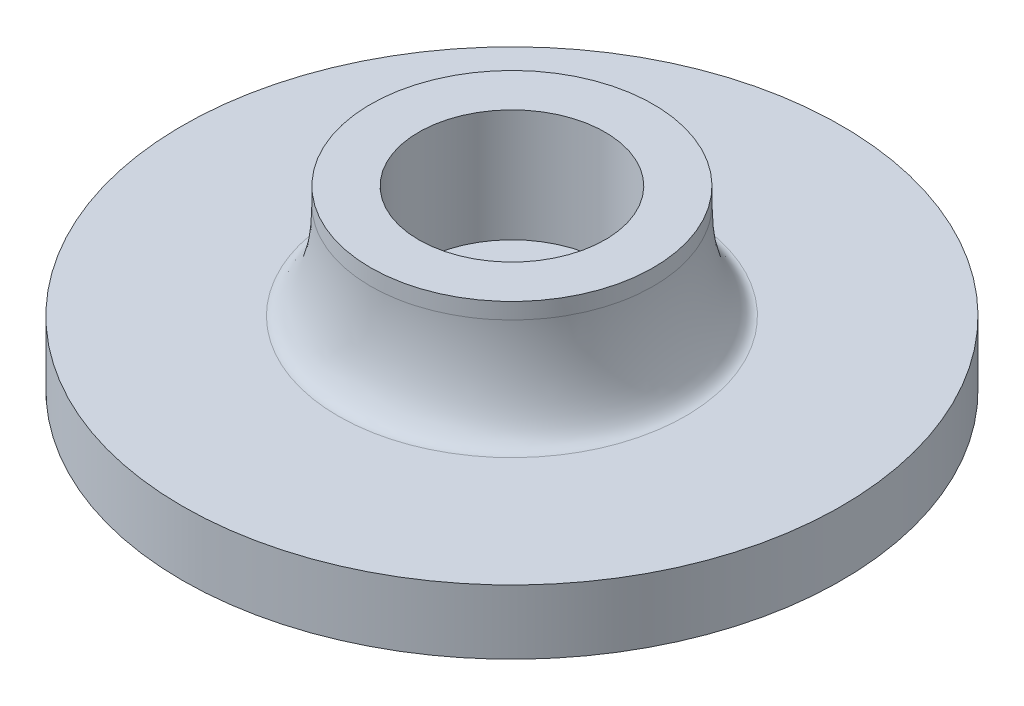
ISO-10303-21;
HEADER;
FILE_DESCRIPTION(('STEP AP214'),'2;1');
FILE_NAME('part.step','',(''),(''),'','','');
FILE_SCHEMA(('AUTOMOTIVE_DESIGN { 1 0 10303 214 1 1 1 1 }'));
ENDSEC;
DATA;
#1=APPLICATION_CONTEXT('core data for automotive mechanical design processes');
#2=APPLICATION_PROTOCOL_DEFINITION('international standard','automotive_design',2000,#1);
#3=PRODUCT_CONTEXT('',#1,'mechanical');
#4=PRODUCT('Part','Part','',(#3));
#5=PRODUCT_RELATED_PRODUCT_CATEGORY('part','',(#4));
#6=PRODUCT_DEFINITION_FORMATION('','',#4);
#7=PRODUCT_DEFINITION_CONTEXT('part definition',#1,'design');
#8=PRODUCT_DEFINITION('design','',#6,#7);
#9=PRODUCT_DEFINITION_SHAPE('','',#8);
#10=(LENGTH_UNIT() NAMED_UNIT(*) SI_UNIT(.MILLI.,.METRE.));
#11=(NAMED_UNIT(*) PLANE_ANGLE_UNIT() SI_UNIT($,.RADIAN.));
#12=(NAMED_UNIT(*) SI_UNIT($,.STERADIAN.) SOLID_ANGLE_UNIT());
#13=UNCERTAINTY_MEASURE_WITH_UNIT(LENGTH_MEASURE(1.E-05),#10,'distance_accuracy_value','');
#14=(GEOMETRIC_REPRESENTATION_CONTEXT(3) GLOBAL_UNCERTAINTY_ASSIGNED_CONTEXT((#13)) GLOBAL_UNIT_ASSIGNED_CONTEXT((#10,
#11,#12)) REPRESENTATION_CONTEXT('',''));
#15=CARTESIAN_POINT('',(0.,0.,0.));
#16=DIRECTION('',(0.,0.,1.));
#17=DIRECTION('',(1.,0.,0.));
#18=AXIS2_PLACEMENT_3D('',#15,#16,#17);
#19=CARTESIAN_POINT('',(0.,2.,0.));
#20=DIRECTION('',(0.,-1.,0.));
#21=DIRECTION('',(0.,0.,-1.));
#22=AXIS2_PLACEMENT_3D('',#19,#20,#21);
#23=CYLINDRICAL_SURFACE('',#22,10.25);
#24=CARTESIAN_POINT('',(0.,2.,0.));
#25=DIRECTION('',(0.,1.,0.));
#26=DIRECTION('',(0.,0.,1.));
#27=AXIS2_PLACEMENT_3D('',#24,#25,#26);
#28=CIRCLE('',#27,10.25);
#29=CARTESIAN_POINT('',(0.,2.,10.25));
#30=VERTEX_POINT('',#29);
#31=EDGE_CURVE('E59',#30,#30,#28,.T.);
#32=ORIENTED_EDGE('',*,*,#31,.F.);
#33=EDGE_LOOP('',(#32));
#34=FACE_BOUND('',#33,.T.);
#35=CARTESIAN_POINT('',(0.,0.,0.));
#36=DIRECTION('',(0.,1.,0.));
#37=DIRECTION('',(0.,0.,1.));
#38=AXIS2_PLACEMENT_3D('',#35,#36,#37);
#39=CIRCLE('',#38,10.25);
#40=CARTESIAN_POINT('',(0.,0.,10.25));
#41=VERTEX_POINT('',#40);
#42=EDGE_CURVE('E64',#41,#41,#39,.T.);
#43=ORIENTED_EDGE('',*,*,#42,.T.);
#44=EDGE_LOOP('',(#43));
#45=FACE_BOUND('',#44,.T.);
#46=ADVANCED_FACE('F36',(#34,#45),#23,.T.);
#47=CARTESIAN_POINT('',(0.,2.,0.));
#48=DIRECTION('',(0.,1.,0.));
#49=DIRECTION('',(0.,0.,1.));
#50=AXIS2_PLACEMENT_3D('',#47,#48,#49);
#51=PLANE('',#50);
#52=CARTESIAN_POINT('',(0.,2.,5.4));
#53=CARTESIAN_POINT('',(0.706858343018677,2.,5.4));
#54=CARTESIAN_POINT('',(1.41343857927273,2.,5.25945245246269));
#55=CARTESIAN_POINT('',(2.71954249027024,2.,4.71844649865921));
#56=CARTESIAN_POINT('',(3.3185522907213,2.,4.31820094609326));
#57=CARTESIAN_POINT('',(4.31820094609342,2.,3.31855229072145));
#58=CARTESIAN_POINT('',(4.71844649865906,2.,2.71954249027046));
#59=CARTESIAN_POINT('',(5.25945245246284,2.,1.41343857927251));
#60=CARTESIAN_POINT('',(5.4,2.,0.70685834301759));
#61=CARTESIAN_POINT('',(5.4,2.,-0.706858343017589));
#62=CARTESIAN_POINT('',(5.25945245246283,2.,-1.41343857927266));
#63=CARTESIAN_POINT('',(4.71844649865906,2.,-2.71954249027031));
#64=CARTESIAN_POINT('',(4.31820094609356,2.,-3.31855229072115));
#65=CARTESIAN_POINT('',(3.31855229072115,2.,-4.31820094609357));
#66=CARTESIAN_POINT('',(2.71954249027033,2.,-4.71844649865904));
#67=CARTESIAN_POINT('',(1.41343857927265,2.,-5.25945245246285));
#68=CARTESIAN_POINT('',(0.70685834301759,2.,-5.4));
#69=CARTESIAN_POINT('',(-0.706858343017589,2.,-5.4));
#70=CARTESIAN_POINT('',(-1.41343857927279,2.,-5.25945245246286));
#71=CARTESIAN_POINT('',(-2.71954249027016,2.,-4.71844649865905));
#72=CARTESIAN_POINT('',(-3.31855229072146,2.,-4.31820094609341));
#73=CARTESIAN_POINT('',(-4.31820094609326,2.,-3.3185522907213));
#74=CARTESIAN_POINT('',(-4.71844649865908,2.,-2.7195424902703));
#75=CARTESIAN_POINT('',(-5.25945245246281,2.,-1.41343857927268));
#76=CARTESIAN_POINT('',(-5.4,2.,-0.706858343017582));
#77=CARTESIAN_POINT('',(-5.4,2.,0.706858343017599));
#78=CARTESIAN_POINT('',(-5.25945245246282,2.,1.41343857927267));
#79=CARTESIAN_POINT('',(-4.71844649865908,2.,2.71954249027028));
#80=CARTESIAN_POINT('',(-4.31820094609345,2.,3.31855229072126));
#81=CARTESIAN_POINT('',(-3.31855229072129,2.,4.31820094609342));
#82=CARTESIAN_POINT('',(-2.7195424902703,2.,4.71844649865908));
#83=CARTESIAN_POINT('',(-1.41343857927269,2.,5.25945245246281));
#84=CARTESIAN_POINT('',(-0.706858343018678,2.,5.4));
#85=CARTESIAN_POINT('',(0.,2.,5.4));
#86=(BOUNDED_CURVE() B_SPLINE_CURVE(3,(#52,#53,#54,#55,#56,#57,#58,#59,#60,#61,#62,#63,#64,#65,
#66,#67,#68,#69,#70,#71,#72,#73,#74,#75,#76,#77,#78,#79,#80,#81,#82,#83,#84,#85),.UNSPECIFIED.,
.T.,.F.) B_SPLINE_CURVE_WITH_KNOTS((4,2,2,2,2,2,2,2,2,2,2,2,2,2,2,2,4),(0.,0.392699081698724,
0.785398163397448,1.17809724509617,1.5707963267949,1.96349540849362,2.35619449019234,
2.74889357189107,3.14159265358979,3.53429173528852,3.92699081698724,4.31968989868597,
4.71238898038469,5.10508806208341,5.49778714378214,5.89048622548086,6.28318530717959),
.UNSPECIFIED.) CURVE() GEOMETRIC_REPRESENTATION_ITEM() RATIONAL_B_SPLINE_CURVE((1.,1.,1.,1.,1.,
1.,1.,1.,1.,1.,1.,1.,1.,1.,1.,1.,1.,1.,1.,1.,1.,1.,1.,1.,1.,1.,1.,1.,1.,1.,1.,1.,1.,1.)) REPRESENTATION_ITEM(''));
#87=CARTESIAN_POINT('',(0.,2.,5.4));
#88=VERTEX_POINT('',#87);
#89=EDGE_CURVE('E11',#88,#88,#86,.F.);
#90=ORIENTED_EDGE('',*,*,#89,.T.);
#91=EDGE_LOOP('',(#90));
#92=FACE_BOUND('',#91,.T.);
#93=ORIENTED_EDGE('',*,*,#31,.T.);
#94=EDGE_LOOP('',(#93));
#95=FACE_BOUND('',#94,.T.);
#96=ADVANCED_FACE('F85',(#92,#95),#51,.T.);
#97=CARTESIAN_POINT('',(0.,0.,0.));
#98=DIRECTION('',(0.,1.,0.));
#99=DIRECTION('',(0.,0.,1.));
#100=AXIS2_PLACEMENT_3D('',#97,#98,#99);
#101=PLANE('',#100);
#102=CARTESIAN_POINT('',(0.,0.,0.));
#103=DIRECTION('',(0.,-1.,0.));
#104=DIRECTION('',(0.,0.,-1.));
#105=AXIS2_PLACEMENT_3D('',#102,#103,#104);
#106=CIRCLE('',#105,1.5);
#107=CARTESIAN_POINT('',(0.,0.,-1.5));
#108=VERTEX_POINT('',#107);
#109=EDGE_CURVE('E139',#108,#108,#106,.T.);
#110=ORIENTED_EDGE('',*,*,#109,.F.);
#111=EDGE_LOOP('',(#110));
#112=FACE_BOUND('',#111,.T.);
#113=ORIENTED_EDGE('',*,*,#42,.F.);
#114=EDGE_LOOP('',(#113));
#115=FACE_BOUND('',#114,.T.);
#116=ADVANCED_FACE('F89',(#112,#115),#101,.F.);
#117=CARTESIAN_POINT('',(0.,5.5,0.));
#118=DIRECTION('',(0.,1.,0.));
#119=DIRECTION('',(0.,0.,1.));
#120=AXIS2_PLACEMENT_3D('',#117,#118,#119);
#121=PLANE('',#120);
#122=CARTESIAN_POINT('',(0.,5.5,0.));
#123=DIRECTION('',(0.,1.,0.));
#124=DIRECTION('',(0.,0.,1.));
#125=AXIS2_PLACEMENT_3D('',#122,#123,#124);
#126=CIRCLE('',#125,4.4);
#127=CARTESIAN_POINT('',(0.,5.5,4.4));
#128=VERTEX_POINT('',#127);
#129=EDGE_CURVE('E127',#128,#128,#126,.T.);
#130=ORIENTED_EDGE('',*,*,#129,.T.);
#131=EDGE_LOOP('',(#130));
#132=FACE_BOUND('',#131,.T.);
#133=CARTESIAN_POINT('',(0.,5.5,0.));
#134=DIRECTION('',(0.,1.,0.));
#135=DIRECTION('',(0.,0.,1.));
#136=AXIS2_PLACEMENT_3D('',#133,#134,#135);
#137=CIRCLE('',#136,2.9);
#138=CARTESIAN_POINT('',(0.,5.5,2.9));
#139=VERTEX_POINT('',#138);
#140=EDGE_CURVE('E129',#139,#139,#137,.T.);
#141=ORIENTED_EDGE('',*,*,#140,.F.);
#142=EDGE_LOOP('',(#141));
#143=FACE_BOUND('',#142,.T.);
#144=ADVANCED_FACE('F83',(#132,#143),#121,.T.);
#145=CARTESIAN_POINT('',(0.,5.5,0.));
#146=DIRECTION('',(0.,-1.,0.));
#147=DIRECTION('',(0.,0.,-1.));
#148=AXIS2_PLACEMENT_3D('',#145,#146,#147);
#149=CYLINDRICAL_SURFACE('',#148,4.4);
#150=CARTESIAN_POINT('',(0.,5.,4.4));
#151=CARTESIAN_POINT('',(-0.575958649867071,5.,4.4));
#152=CARTESIAN_POINT('',(-1.1516906942222,5.,4.28547977608081));
#153=CARTESIAN_POINT('',(-2.2159235105906,5.,3.84466011001851));
#154=CARTESIAN_POINT('',(-2.70400557021741,5.,3.51853410422421));
#155=CARTESIAN_POINT('',(-3.51853410422423,5.,2.70400557021739));
#156=CARTESIAN_POINT('',(-3.84466011001852,5.,2.21592351059056));
#157=CARTESIAN_POINT('',(-4.28547977608081,5.,1.15169069422221));
#158=CARTESIAN_POINT('',(-4.4,5.,0.575958649866192));
#159=CARTESIAN_POINT('',(-4.4,5.,-0.575958649866178));
#160=CARTESIAN_POINT('',(-4.28547977608081,5.,-1.1516906942222));
#161=CARTESIAN_POINT('',(-3.84466011001851,5.,-2.2159235105906));
#162=CARTESIAN_POINT('',(-3.51853410422413,5.,-2.70400557021749));
#163=CARTESIAN_POINT('',(-2.70400557021749,5.,-3.51853410422412));
#164=CARTESIAN_POINT('',(-2.21592351059051,5.,-3.84466011001854));
#165=CARTESIAN_POINT('',(-1.15169069422227,5.,-4.28547977608078));
#166=CARTESIAN_POINT('',(-0.575958649866184,5.,-4.4));
#167=CARTESIAN_POINT('',(0.575958649866185,5.,-4.4));
#168=CARTESIAN_POINT('',(1.15169069422221,5.,-4.28547977608081));
#169=CARTESIAN_POINT('',(2.21592351059059,5.,-3.84466011001851));
#170=CARTESIAN_POINT('',(2.70400557021726,5.,-3.51853410422436));
#171=CARTESIAN_POINT('',(3.51853410422435,5.,-2.70400557021726));
#172=CARTESIAN_POINT('',(3.84466011001849,5.,-2.21592351059064));
#173=CARTESIAN_POINT('',(4.28547977608083,5.,-1.15169069422215));
#174=CARTESIAN_POINT('',(4.4,5.,-0.575958649866184));
#175=CARTESIAN_POINT('',(4.4,5.,0.575958649866184));
#176=CARTESIAN_POINT('',(4.28547977608086,5.,1.15169069422208));
#177=CARTESIAN_POINT('',(3.84466011001846,5.,2.21592351059071));
#178=CARTESIAN_POINT('',(3.51853410422419,5.,2.70400557021743));
#179=CARTESIAN_POINT('',(2.70400557021743,5.,3.51853410422419));
#180=CARTESIAN_POINT('',(2.21592351059063,5.,3.84466011001849));
#181=CARTESIAN_POINT('',(1.15169069422216,5.,4.28547977608083));
#182=CARTESIAN_POINT('',(0.57595864986707,5.,4.4));
#183=CARTESIAN_POINT('',(0.,5.,4.4));
#184=(BOUNDED_CURVE() B_SPLINE_CURVE(3,(#150,#151,#152,#153,#154,#155,#156,#157,#158,#159,#160,
#161,#162,#163,#164,#165,#166,#167,#168,#169,#170,#171,#172,#173,#174,#175,#176,#177,#178,#179,
#180,#181,#182,#183),.UNSPECIFIED.,.T.,.F.) B_SPLINE_CURVE_WITH_KNOTS((4,2,2,2,2,2,2,2,2,2,2,2,
2,2,2,2,4),(0.,0.392699081698725,0.785398163397448,1.17809724509617,1.5707963267949,
1.96349540849362,2.35619449019234,2.74889357189107,3.14159265358979,3.53429173528852,
3.92699081698724,4.31968989868597,4.71238898038469,5.10508806208341,5.49778714378214,
5.89048622548086,6.28318530717959),
.UNSPECIFIED.) CURVE() GEOMETRIC_REPRESENTATION_ITEM() RATIONAL_B_SPLINE_CURVE((1.,1.,1.,1.,1.,
1.,1.,1.,1.,1.,1.,1.,1.,1.,1.,1.,1.,1.,1.,1.,1.,1.,1.,1.,1.,1.,1.,1.,1.,1.,1.,1.,1.,1.)) REPRESENTATION_ITEM(''));
#185=CARTESIAN_POINT('',(0.,5.,4.4));
#186=VERTEX_POINT('',#185);
#187=EDGE_CURVE('E49',#186,#186,#184,.F.);
#188=ORIENTED_EDGE('',*,*,#187,.T.);
#189=EDGE_LOOP('',(#188));
#190=FACE_BOUND('',#189,.T.);
#191=ORIENTED_EDGE('',*,*,#129,.F.);
#192=EDGE_LOOP('',(#191));
#193=FACE_BOUND('',#192,.T.);
#194=ADVANCED_FACE('F72',(#190,#193),#149,.T.);
#195=CARTESIAN_POINT('',(0.,5.5,0.));
#196=DIRECTION('',(0.,-1.,0.));
#197=DIRECTION('',(0.,0.,-1.));
#198=AXIS2_PLACEMENT_3D('',#195,#196,#197);
#199=CYLINDRICAL_SURFACE('',#198,2.9);
#200=ORIENTED_EDGE('',*,*,#140,.T.);
#201=EDGE_LOOP('',(#200));
#202=FACE_BOUND('',#201,.T.);
#203=CARTESIAN_POINT('',(0.,2.,0.));
#204=DIRECTION('',(0.,1.,0.));
#205=DIRECTION('',(0.,0.,1.));
#206=AXIS2_PLACEMENT_3D('',#203,#204,#205);
#207=CIRCLE('',#206,2.9);
#208=CARTESIAN_POINT('',(0.,2.,2.9));
#209=VERTEX_POINT('',#208);
#210=EDGE_CURVE('E54',#209,#209,#207,.F.);
#211=ORIENTED_EDGE('',*,*,#210,.T.);
#212=EDGE_LOOP('',(#211));
#213=FACE_BOUND('',#212,.T.);
#214=ADVANCED_FACE('F82',(#202,#213),#199,.F.);
#215=CARTESIAN_POINT('',(0.,2.,0.));
#216=DIRECTION('',(0.,1.,0.));
#217=DIRECTION('',(0.,0.,1.));
#218=AXIS2_PLACEMENT_3D('',#215,#216,#217);
#219=CIRCLE('',#218,1.5);
#220=CARTESIAN_POINT('',(0.,2.,1.5));
#221=VERTEX_POINT('',#220);
#222=EDGE_CURVE('E134',#221,#221,#219,.F.);
#223=ORIENTED_EDGE('',*,*,#222,.T.);
#224=EDGE_LOOP('',(#223));
#225=FACE_BOUND('',#224,.T.);
#226=ORIENTED_EDGE('',*,*,#210,.F.);
#227=EDGE_LOOP('',(#226));
#228=FACE_BOUND('',#227,.T.);
#229=ADVANCED_FACE('F90',(#225,#228),#51,.T.);
#230=CARTESIAN_POINT('',(0.,5.,4.4));
#231=CARTESIAN_POINT('',(0.57595864986707,5.,4.4));
#232=CARTESIAN_POINT('',(1.15169069422216,5.,4.28547977608083));
#233=CARTESIAN_POINT('',(2.21592351059063,5.,3.84466011001849));
#234=CARTESIAN_POINT('',(2.70400557021743,5.,3.51853410422419));
#235=CARTESIAN_POINT('',(3.51853410422419,5.,2.70400557021743));
#236=CARTESIAN_POINT('',(3.84466011001846,5.,2.21592351059071));
#237=CARTESIAN_POINT('',(4.28547977608086,5.,1.15169069422208));
#238=CARTESIAN_POINT('',(4.4,5.,0.575958649866184));
#239=CARTESIAN_POINT('',(4.4,5.,-0.575958649866184));
#240=CARTESIAN_POINT('',(4.28547977608083,5.,-1.15169069422215));
#241=CARTESIAN_POINT('',(3.84466011001849,5.,-2.21592351059064));
#242=CARTESIAN_POINT('',(3.51853410422435,5.,-2.70400557021726));
#243=CARTESIAN_POINT('',(2.70400557021726,5.,-3.51853410422436));
#244=CARTESIAN_POINT('',(2.21592351059059,5.,-3.84466011001851));
#245=CARTESIAN_POINT('',(1.15169069422221,5.,-4.28547977608081));
#246=CARTESIAN_POINT('',(0.575958649866185,5.,-4.4));
#247=CARTESIAN_POINT('',(-0.575958649866184,5.,-4.4));
#248=CARTESIAN_POINT('',(-1.15169069422227,5.,-4.28547977608078));
#249=CARTESIAN_POINT('',(-2.21592351059051,5.,-3.84466011001854));
#250=CARTESIAN_POINT('',(-2.70400557021749,5.,-3.51853410422412));
#251=CARTESIAN_POINT('',(-3.51853410422413,5.,-2.70400557021749));
#252=CARTESIAN_POINT('',(-3.84466011001851,5.,-2.2159235105906));
#253=CARTESIAN_POINT('',(-4.28547977608081,5.,-1.1516906942222));
#254=CARTESIAN_POINT('',(-4.4,5.,-0.575958649866178));
#255=CARTESIAN_POINT('',(-4.4,5.,0.575958649866192));
#256=CARTESIAN_POINT('',(-4.28547977608081,5.,1.15169069422221));
#257=CARTESIAN_POINT('',(-3.84466011001852,5.,2.21592351059056));
#258=CARTESIAN_POINT('',(-3.51853410422423,5.,2.70400557021739));
#259=CARTESIAN_POINT('',(-2.70400557021741,5.,3.51853410422421));
#260=CARTESIAN_POINT('',(-2.2159235105906,5.,3.84466011001851));
#261=CARTESIAN_POINT('',(-1.1516906942222,5.,4.28547977608081));
#262=CARTESIAN_POINT('',(-0.575958649867071,5.,4.4));
#263=CARTESIAN_POINT('',(0.,5.,4.4));
#264=CARTESIAN_POINT('',(0.,2.,4.4));
#265=CARTESIAN_POINT('',(0.57595864986707,2.,4.4));
#266=CARTESIAN_POINT('',(1.1516906942222,2.,4.28547977608095));
#267=CARTESIAN_POINT('',(2.21592351059059,2.,3.84466011001837));
#268=CARTESIAN_POINT('',(2.70400557021735,2.,3.51853410422427));
#269=CARTESIAN_POINT('',(3.51853410422426,2.,2.70400557021735));
#270=CARTESIAN_POINT('',(3.84466011001851,2.,2.21592351059072));
#271=CARTESIAN_POINT('',(4.28547977608082,2.,1.15169069422206));
#272=CARTESIAN_POINT('',(4.4,2.,0.575958649866184));
#273=CARTESIAN_POINT('',(4.4,2.,-0.575958649866183));
#274=CARTESIAN_POINT('',(4.28547977608082,2.,-1.15169069422214));
#275=CARTESIAN_POINT('',(3.8446601100185,2.,-2.21592351059065));
#276=CARTESIAN_POINT('',(3.51853410422435,2.,-2.70400557021726));
#277=CARTESIAN_POINT('',(2.70400557021726,2.,-3.51853410422436));
#278=CARTESIAN_POINT('',(2.2159235105906,2.,-3.84466011001855));
#279=CARTESIAN_POINT('',(1.1516906942222,2.,-4.28547977608077));
#280=CARTESIAN_POINT('',(0.575958649866184,2.,-4.4));
#281=CARTESIAN_POINT('',(-0.575958649866183,2.,-4.4));
#282=CARTESIAN_POINT('',(-1.15169069422234,2.,-4.28547977608078));
#283=CARTESIAN_POINT('',(-2.21592351059044,2.,-3.84466011001855));
#284=CARTESIAN_POINT('',(-2.70400557021742,2.,-3.51853410422435));
#285=CARTESIAN_POINT('',(-3.5185341042242,2.,-2.70400557021726));
#286=CARTESIAN_POINT('',(-3.84466011001877,2.,-2.21592351059071));
#287=CARTESIAN_POINT('',(-4.28547977608055,2.,-1.15169069422209));
#288=CARTESIAN_POINT('',(-4.4,2.,-0.575958649866177));
#289=CARTESIAN_POINT('',(-4.4,2.,0.575958649866191));
#290=CARTESIAN_POINT('',(-4.28547977608086,2.,1.15169069422224));
#291=CARTESIAN_POINT('',(-3.84466011001847,2.,2.21592351059054));
#292=CARTESIAN_POINT('',(-3.51853410422415,1.99999999999985,2.70400557021731));
#293=CARTESIAN_POINT('',(-2.70400557021748,2.00000000000015,3.51853410422429));
#294=CARTESIAN_POINT('',(-2.21592351059071,1.99999999999985,3.84466011001877));
#295=CARTESIAN_POINT('',(-1.15169069422209,2.00000000000015,4.28547977608055));
#296=CARTESIAN_POINT('',(-0.575958649867071,2.,4.4));
#297=CARTESIAN_POINT('',(0.,2.,4.4));
#298=CARTESIAN_POINT('',(0.,2.,5.4));
#299=CARTESIAN_POINT('',(0.706858343018677,2.,5.4));
#300=CARTESIAN_POINT('',(1.41343857927273,2.,5.25945245246269));
#301=CARTESIAN_POINT('',(2.71954249027024,2.,4.71844649865921));
#302=CARTESIAN_POINT('',(3.3185522907213,2.,4.31820094609326));
#303=CARTESIAN_POINT('',(4.31820094609342,2.,3.31855229072145));
#304=CARTESIAN_POINT('',(4.71844649865906,2.,2.71954249027046));
#305=CARTESIAN_POINT('',(5.25945245246284,2.,1.41343857927251));
#306=CARTESIAN_POINT('',(5.4,2.,0.70685834301759));
#307=CARTESIAN_POINT('',(5.4,2.,-0.706858343017589));
#308=CARTESIAN_POINT('',(5.25945245246283,2.,-1.41343857927266));
#309=CARTESIAN_POINT('',(4.71844649865906,2.,-2.71954249027031));
#310=CARTESIAN_POINT('',(4.31820094609356,2.,-3.31855229072115));
#311=CARTESIAN_POINT('',(3.31855229072115,2.,-4.31820094609357));
#312=CARTESIAN_POINT('',(2.71954249027033,2.,-4.71844649865904));
#313=CARTESIAN_POINT('',(1.41343857927265,2.,-5.25945245246285));
#314=CARTESIAN_POINT('',(0.70685834301759,2.,-5.4));
#315=CARTESIAN_POINT('',(-0.706858343017589,2.,-5.4));
#316=CARTESIAN_POINT('',(-1.41343857927279,2.,-5.25945245246286));
#317=CARTESIAN_POINT('',(-2.71954249027016,2.,-4.71844649865905));
#318=CARTESIAN_POINT('',(-3.31855229072146,2.,-4.31820094609341));
#319=CARTESIAN_POINT('',(-4.31820094609326,2.,-3.3185522907213));
#320=CARTESIAN_POINT('',(-4.71844649865908,2.,-2.7195424902703));
#321=CARTESIAN_POINT('',(-5.25945245246281,2.,-1.41343857927268));
#322=CARTESIAN_POINT('',(-5.4,2.,-0.706858343017582));
#323=CARTESIAN_POINT('',(-5.4,2.,0.706858343017599));
#324=CARTESIAN_POINT('',(-5.25945245246282,2.,1.41343857927267));
#325=CARTESIAN_POINT('',(-4.71844649865908,2.,2.71954249027028));
#326=CARTESIAN_POINT('',(-4.31820094609345,2.,3.31855229072126));
#327=CARTESIAN_POINT('',(-3.31855229072129,2.,4.31820094609342));
#328=CARTESIAN_POINT('',(-2.7195424902703,2.,4.71844649865908));
#329=CARTESIAN_POINT('',(-1.41343857927269,2.,5.25945245246281));
#330=CARTESIAN_POINT('',(-0.706858343018678,2.,5.4));
#331=CARTESIAN_POINT('',(0.,2.,5.4));
#332=(BOUNDED_SURFACE() B_SPLINE_SURFACE(2,3,((#230,#231,#232,#233,#234,#235,#236,#237,#238,
#239,#240,#241,#242,#243,#244,#245,#246,#247,#248,#249,#250,#251,#252,#253,#254,#255,#256,#257,
#258,#259,#260,#261,#262,#263),(#264,#265,#266,#267,#268,#269,#270,#271,#272,#273,#274,#275,
#276,#277,#278,#279,#280,#281,#282,#283,#284,#285,#286,#287,#288,#289,#290,#291,#292,#293,#294,
#295,#296,#297),(#298,#299,#300,#301,#302,#303,#304,#305,#306,#307,#308,#309,#310,#311,#312,
#313,#314,#315,#316,#317,#318,#319,#320,#321,#322,#323,#324,#325,#326,#327,#328,#329,#330,
#331)),.UNSPECIFIED.,.F.,.T.,.F.) B_SPLINE_SURFACE_WITH_KNOTS((3,3),(4,2,2,2,2,2,2,2,2,2,2,2,2,
2,2,2,4),(0.,1.),(0.,0.392699081698724,0.785398163397448,1.17809724509617,1.5707963267949,
1.96349540849362,2.35619449019234,2.74889357189107,3.14159265358979,3.53429173528852,
3.92699081698724,4.31968989868597,4.71238898038469,5.10508806208341,5.49778714378214,
5.89048622548086,6.28318530717959),
.UNSPECIFIED.) GEOMETRIC_REPRESENTATION_ITEM() RATIONAL_B_SPLINE_SURFACE(((1.,1.,1.,1.,1.,1.,1.,
1.,1.,1.,1.,1.,1.,1.,1.,1.,1.,1.,1.,1.,1.,1.,1.,1.,1.,1.,1.,1.,1.,1.,1.,1.,1.,1.),
(0.707106781186548,0.707106781186548,0.707106781186548,0.707106781186548,0.707106781186548,
0.707106781186548,0.707106781186548,0.707106781186548,0.707106781186548,0.707106781186548,
0.707106781186548,0.707106781186548,0.707106781186548,0.707106781186548,0.707106781186548,
0.707106781186548,0.707106781186548,0.707106781186548,0.707106781186548,0.707106781186548,
0.707106781186548,0.707106781186548,0.707106781186548,0.707106781186548,0.707106781186548,
0.707106781186548,0.707106781186548,0.707106781186548,0.707106781186548,0.707106781186548,
0.707106781186548,0.707106781186548,0.707106781186548,0.707106781186548),(1.,1.,1.,1.,1.,1.,1.,
1.,1.,1.,1.,1.,1.,1.,1.,1.,1.,1.,1.,1.,1.,1.,1.,1.,1.,1.,1.,1.,1.,1.,1.,1.,1.,1.))) REPRESENTATION_ITEM('') SURFACE());
#333=ORIENTED_EDGE('',*,*,#89,.F.);
#334=EDGE_LOOP('',(#333));
#335=FACE_BOUND('',#334,.T.);
#336=ORIENTED_EDGE('',*,*,#187,.F.);
#337=EDGE_LOOP('',(#336));
#338=FACE_BOUND('',#337,.T.);
#339=ADVANCED_FACE('F39',(#335,#338),#332,.T.);
#340=CARTESIAN_POINT('',(0.,6.24264068711929,0.));
#341=DIRECTION('',(0.,-1.,0.));
#342=DIRECTION('',(0.,0.,-1.));
#343=AXIS2_PLACEMENT_3D('',#340,#341,#342);
#344=CYLINDRICAL_SURFACE('',#343,1.5);
#345=ORIENTED_EDGE('',*,*,#109,.T.);
#346=EDGE_LOOP('',(#345));
#347=FACE_BOUND('',#346,.T.);
#348=ORIENTED_EDGE('',*,*,#222,.F.);
#349=EDGE_LOOP('',(#348));
#350=FACE_BOUND('',#349,.T.);
#351=ADVANCED_FACE('F110',(#347,#350),#344,.F.);
#352=CLOSED_SHELL('',(#46,#96,#116,#144,#194,#214,#229,#339,#351));
#353=MANIFOLD_SOLID_BREP('B2',#352);
#354=ADVANCED_BREP_SHAPE_REPRESENTATION('',(#18,#353),#14);
#355=SHAPE_DEFINITION_REPRESENTATION(#9,#354);
ENDSEC;
END-ISO-10303-21;
